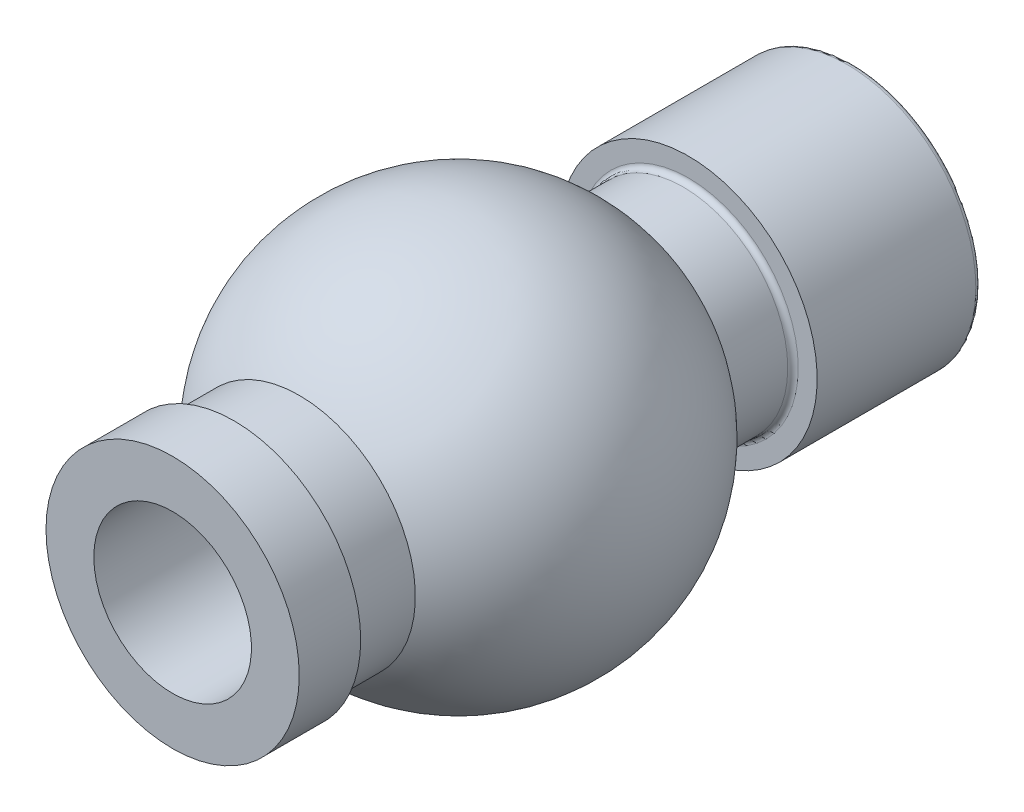
ISO-10303-21;
HEADER;
FILE_DESCRIPTION(('STEP AP214'),'2;1');
FILE_NAME('part.step','',(''),(''),'','','');
FILE_SCHEMA(('AUTOMOTIVE_DESIGN { 1 0 10303 214 1 1 1 1 }'));
ENDSEC;
DATA;
#1=APPLICATION_CONTEXT('core data for automotive mechanical design processes');
#2=APPLICATION_PROTOCOL_DEFINITION('international standard','automotive_design',2000,#1);
#3=PRODUCT_CONTEXT('',#1,'mechanical');
#4=PRODUCT('Part','Part','',(#3));
#5=PRODUCT_RELATED_PRODUCT_CATEGORY('part','',(#4));
#6=PRODUCT_DEFINITION_FORMATION('','',#4);
#7=PRODUCT_DEFINITION_CONTEXT('part definition',#1,'design');
#8=PRODUCT_DEFINITION('design','',#6,#7);
#9=PRODUCT_DEFINITION_SHAPE('','',#8);
#10=(LENGTH_UNIT() NAMED_UNIT(*) SI_UNIT(.MILLI.,.METRE.));
#11=(NAMED_UNIT(*) PLANE_ANGLE_UNIT() SI_UNIT($,.RADIAN.));
#12=(NAMED_UNIT(*) SI_UNIT($,.STERADIAN.) SOLID_ANGLE_UNIT());
#13=UNCERTAINTY_MEASURE_WITH_UNIT(LENGTH_MEASURE(1.E-05),#10,'distance_accuracy_value','');
#14=(GEOMETRIC_REPRESENTATION_CONTEXT(3) GLOBAL_UNCERTAINTY_ASSIGNED_CONTEXT((#13)) GLOBAL_UNIT_ASSIGNED_CONTEXT((#10,
#11,#12)) REPRESENTATION_CONTEXT('',''));
#15=CARTESIAN_POINT('',(0.,0.,0.));
#16=DIRECTION('',(0.,0.,1.));
#17=DIRECTION('',(1.,0.,0.));
#18=AXIS2_PLACEMENT_3D('',#15,#16,#17);
#19=CARTESIAN_POINT('',(0.,0.,3.12));
#20=DIRECTION('',(0.,0.,1.));
#21=DIRECTION('',(1.,0.,0.));
#22=AXIS2_PLACEMENT_3D('',#19,#20,#21);
#23=PLANE('',#22);
#24=CARTESIAN_POINT('',(0.,0.,3.12));
#25=DIRECTION('',(0.,0.,1.));
#26=DIRECTION('',(1.,0.,0.));
#27=AXIS2_PLACEMENT_3D('',#24,#25,#26);
#28=CIRCLE('',#27,2.09);
#29=CARTESIAN_POINT('',(2.09,0.,3.12));
#30=VERTEX_POINT('',#29);
#31=EDGE_CURVE('E10',#30,#30,#28,.F.);
#32=ORIENTED_EDGE('',*,*,#31,.T.);
#33=EDGE_LOOP('',(#32));
#34=FACE_BOUND('',#33,.T.);
#35=CARTESIAN_POINT('',(0.,0.,3.12));
#36=DIRECTION('',(0.,0.,1.));
#37=DIRECTION('',(1.,0.,0.));
#38=AXIS2_PLACEMENT_3D('',#35,#36,#37);
#39=CIRCLE('',#38,2.45);
#40=CARTESIAN_POINT('',(-2.45,0.,3.12));
#41=VERTEX_POINT('',#40);
#42=EDGE_CURVE('E54',#41,#41,#39,.T.);
#43=ORIENTED_EDGE('',*,*,#42,.T.);
#44=EDGE_LOOP('',(#43));
#45=FACE_BOUND('',#44,.T.);
#46=ADVANCED_FACE('F34',(#34,#45),#23,.T.);
#47=CARTESIAN_POINT('',(0.,0.,0.));
#48=DIRECTION('',(0.,0.,1.));
#49=DIRECTION('',(1.,0.,0.));
#50=AXIS2_PLACEMENT_3D('',#47,#48,#49);
#51=PLANE('',#50);
#52=CARTESIAN_POINT('',(0.,0.,0.));
#53=DIRECTION('',(0.,0.,1.));
#54=DIRECTION('',(1.,0.,0.));
#55=AXIS2_PLACEMENT_3D('',#52,#53,#54);
#56=CIRCLE('',#55,2.35);
#57=CARTESIAN_POINT('',(2.35,0.,0.));
#58=VERTEX_POINT('',#57);
#59=EDGE_CURVE('E45',#58,#58,#56,.F.);
#60=ORIENTED_EDGE('',*,*,#59,.T.);
#61=EDGE_LOOP('',(#60));
#62=FACE_BOUND('',#61,.T.);
#63=CARTESIAN_POINT('',(0.,0.,0.));
#64=DIRECTION('',(0.,0.,1.));
#65=DIRECTION('',(1.,0.,0.));
#66=AXIS2_PLACEMENT_3D('',#63,#64,#65);
#67=CIRCLE('',#66,1.5);
#68=CARTESIAN_POINT('',(-1.5,0.,0.));
#69=VERTEX_POINT('',#68);
#70=EDGE_CURVE('E57',#69,#69,#67,.T.);
#71=ORIENTED_EDGE('',*,*,#70,.T.);
#72=EDGE_LOOP('',(#71));
#73=FACE_BOUND('',#72,.T.);
#74=ADVANCED_FACE('F98',(#62,#73),#51,.F.);
#75=CARTESIAN_POINT('',(0.,0.,3.12));
#76=DIRECTION('',(0.,0.,-1.));
#77=DIRECTION('',(-1.,0.,0.));
#78=AXIS2_PLACEMENT_3D('',#75,#76,#77);
#79=CYLINDRICAL_SURFACE('',#78,2.45);
#80=CARTESIAN_POINT('',(0.,0.,0.0999999999999998));
#81=DIRECTION('',(0.,0.,1.));
#82=DIRECTION('',(1.,0.,0.));
#83=AXIS2_PLACEMENT_3D('',#80,#81,#82);
#84=CIRCLE('',#83,2.45);
#85=CARTESIAN_POINT('',(-2.45,0.,0.0999999999999994));
#86=VERTEX_POINT('',#85);
#87=EDGE_CURVE('E49',#86,#86,#84,.T.);
#88=CARTESIAN_POINT('',(-2.45,0.,0.0999999999999994));
#89=CARTESIAN_POINT('',(-2.45,0.,0.131458333333333));
#90=CARTESIAN_POINT('',(-2.45,0.,0.162916666666666));
#91=CARTESIAN_POINT('',(-2.45,0.,0.225833333333333));
#92=CARTESIAN_POINT('',(-2.45,0.,0.257291666666666));
#93=CARTESIAN_POINT('',(-2.45,0.,0.320208333333333));
#94=CARTESIAN_POINT('',(-2.45,0.,0.351666666666666));
#95=CARTESIAN_POINT('',(-2.45,0.,0.414583333333333));
#96=CARTESIAN_POINT('',(-2.45,0.,0.446041666666666));
#97=CARTESIAN_POINT('',(-2.45,0.,0.508958333333333));
#98=CARTESIAN_POINT('',(-2.45,0.,0.540416666666666));
#99=CARTESIAN_POINT('',(-2.45,0.,0.603333333333333));
#100=CARTESIAN_POINT('',(-2.45,0.,0.634791666666666));
#101=CARTESIAN_POINT('',(-2.45,0.,0.697708333333333));
#102=CARTESIAN_POINT('',(-2.45,0.,0.729166666666666));
#103=CARTESIAN_POINT('',(-2.45,0.,0.792083333333333));
#104=CARTESIAN_POINT('',(-2.45,0.,0.823541666666666));
#105=CARTESIAN_POINT('',(-2.45,0.,0.886458333333333));
#106=CARTESIAN_POINT('',(-2.45,0.,0.917916666666666));
#107=CARTESIAN_POINT('',(-2.45,0.,0.980833333333333));
#108=CARTESIAN_POINT('',(-2.45,0.,1.01229166666667));
#109=CARTESIAN_POINT('',(-2.45,0.,1.07520833333333));
#110=CARTESIAN_POINT('',(-2.45,0.,1.10666666666667));
#111=CARTESIAN_POINT('',(-2.45,0.,1.16958333333333));
#112=CARTESIAN_POINT('',(-2.45,0.,1.20104166666667));
#113=CARTESIAN_POINT('',(-2.45,0.,1.26395833333333));
#114=CARTESIAN_POINT('',(-2.45,0.,1.29541666666667));
#115=CARTESIAN_POINT('',(-2.45,0.,1.35833333333333));
#116=CARTESIAN_POINT('',(-2.45,0.,1.38979166666667));
#117=CARTESIAN_POINT('',(-2.45,0.,1.45270833333333));
#118=CARTESIAN_POINT('',(-2.45,0.,1.48416666666667));
#119=CARTESIAN_POINT('',(-2.45,0.,1.54708333333333));
#120=CARTESIAN_POINT('',(-2.45,0.,1.57854166666667));
#121=CARTESIAN_POINT('',(-2.45,0.,1.64145833333333));
#122=CARTESIAN_POINT('',(-2.45,0.,1.67291666666667));
#123=CARTESIAN_POINT('',(-2.45,0.,1.73583333333333));
#124=CARTESIAN_POINT('',(-2.45,0.,1.76729166666667));
#125=CARTESIAN_POINT('',(-2.45,0.,1.83020833333333));
#126=CARTESIAN_POINT('',(-2.45,0.,1.86166666666667));
#127=CARTESIAN_POINT('',(-2.45,0.,1.92458333333333));
#128=CARTESIAN_POINT('',(-2.45,0.,1.95604166666667));
#129=CARTESIAN_POINT('',(-2.45,0.,2.01895833333333));
#130=CARTESIAN_POINT('',(-2.45,0.,2.05041666666667));
#131=CARTESIAN_POINT('',(-2.45,0.,2.11333333333333));
#132=CARTESIAN_POINT('',(-2.45,0.,2.14479166666667));
#133=CARTESIAN_POINT('',(-2.45,0.,2.20770833333333));
#134=CARTESIAN_POINT('',(-2.45,0.,2.23916666666667));
#135=CARTESIAN_POINT('',(-2.45,0.,2.30208333333333));
#136=CARTESIAN_POINT('',(-2.45,0.,2.33354166666667));
#137=CARTESIAN_POINT('',(-2.45,0.,2.39645833333333));
#138=CARTESIAN_POINT('',(-2.45,0.,2.42791666666667));
#139=CARTESIAN_POINT('',(-2.45,0.,2.49083333333333));
#140=CARTESIAN_POINT('',(-2.45,0.,2.52229166666667));
#141=CARTESIAN_POINT('',(-2.45,0.,2.58520833333333));
#142=CARTESIAN_POINT('',(-2.45,0.,2.61666666666667));
#143=CARTESIAN_POINT('',(-2.45,0.,2.67958333333333));
#144=CARTESIAN_POINT('',(-2.45,0.,2.71104166666667));
#145=CARTESIAN_POINT('',(-2.45,0.,2.77395833333333));
#146=CARTESIAN_POINT('',(-2.45,0.,2.80541666666667));
#147=CARTESIAN_POINT('',(-2.45,0.,2.86833333333333));
#148=CARTESIAN_POINT('',(-2.45,0.,2.89979166666667));
#149=CARTESIAN_POINT('',(-2.45,0.,2.96270833333333));
#150=CARTESIAN_POINT('',(-2.45,0.,2.99416666666667));
#151=CARTESIAN_POINT('',(-2.45,0.,3.05708333333333));
#152=CARTESIAN_POINT('',(-2.45,0.,3.08854166666667));
#153=CARTESIAN_POINT('',(-2.45,0.,3.12));
#154=B_SPLINE_CURVE_WITH_KNOTS('',3,(#88,#89,#90,#91,#92,#93,#94,#95,#96,#97,#98,#99,#100,#101,
#102,#103,#104,#105,#106,#107,#108,#109,#110,#111,#112,#113,#114,#115,#116,#117,#118,#119,#120,
#121,#122,#123,#124,#125,#126,#127,#128,#129,#130,#131,#132,#133,#134,#135,#136,#137,#138,#139,
#140,#141,#142,#143,#144,#145,#146,#147,#148,#149,#150,#151,#152,#153),.UNSPECIFIED.,.F.,.F.,(4,
2,2,2,2,2,2,2,2,2,2,2,2,2,2,2,2,2,2,2,2,2,2,2,2,2,2,2,2,2,2,2,4),(0.,0.0943749999999998,0.18875,
0.283125,0.3775,0.471875,0.56625,0.660625,0.755,0.849375,0.94375,1.038125,1.1325,1.226875,
1.32125,1.415625,1.51,1.604375,1.69875,1.793125,1.8875,1.981875,2.07625,2.170625,2.265,2.359375,
2.45375,2.548125,2.6425,2.736875,2.83125,2.925625,3.02),.UNSPECIFIED.);
#155=EDGE_CURVE('BSEAM103',#86,#41,#154,.T.);
#156=ORIENTED_EDGE('',*,*,#87,.T.);
#157=ORIENTED_EDGE('',*,*,#42,.F.);
#158=ORIENTED_EDGE('',*,*,#155,.T.);
#159=ORIENTED_EDGE('',*,*,#155,.F.);
#160=EDGE_LOOP('',(#156,#158,#157,#159));
#161=FACE_BOUND('',#160,.T.);
#162=ADVANCED_FACE('F103',(#161),#79,.T.);
#163=CARTESIAN_POINT('',(0.,0.,3.12));
#164=DIRECTION('',(0.,0.,-1.));
#165=DIRECTION('',(-1.,0.,0.));
#166=AXIS2_PLACEMENT_3D('',#163,#164,#165);
#167=CYLINDRICAL_SURFACE('',#166,1.5);
#168=CARTESIAN_POINT('',(0.,0.,12.9380147147089));
#169=DIRECTION('',(0.,0.,1.));
#170=DIRECTION('',(1.,0.,0.));
#171=AXIS2_PLACEMENT_3D('',#168,#169,#170);
#172=CIRCLE('',#171,1.5);
#173=CARTESIAN_POINT('',(-1.5,0.,12.9380147147089));
#174=VERTEX_POINT('',#173);
#175=EDGE_CURVE('E73',#174,#174,#172,.T.);
#176=CARTESIAN_POINT('',(-1.5,0.,0.));
#177=CARTESIAN_POINT('',(-1.5,0.,0.134770986611551));
#178=CARTESIAN_POINT('',(-1.5,0.,0.269541973223101));
#179=CARTESIAN_POINT('',(-1.5,0.,0.539083946446203));
#180=CARTESIAN_POINT('',(-1.5,0.,0.673854933057754));
#181=CARTESIAN_POINT('',(-1.5,0.,0.943396906280855));
#182=CARTESIAN_POINT('',(-1.5,0.,1.07816789289241));
#183=CARTESIAN_POINT('',(-1.5,0.,1.34770986611551));
#184=CARTESIAN_POINT('',(-1.5,0.,1.48248085272706));
#185=CARTESIAN_POINT('',(-1.5,0.,1.75202282595016));
#186=CARTESIAN_POINT('',(-1.5,0.,1.88679381256171));
#187=CARTESIAN_POINT('',(-1.5,0.,2.15633578578481));
#188=CARTESIAN_POINT('',(-1.5,0.,2.29110677239636));
#189=CARTESIAN_POINT('',(-1.5,0.,2.56064874561946));
#190=CARTESIAN_POINT('',(-1.5,0.,2.69541973223102));
#191=CARTESIAN_POINT('',(-1.5,0.,2.96496170545412));
#192=CARTESIAN_POINT('',(-1.5,0.,3.09973269206567));
#193=CARTESIAN_POINT('',(-1.5,0.,3.36927466528877));
#194=CARTESIAN_POINT('',(-1.5,0.,3.50404565190032));
#195=CARTESIAN_POINT('',(-1.5,0.,3.77358762512342));
#196=CARTESIAN_POINT('',(-1.5,0.,3.90835861173497));
#197=CARTESIAN_POINT('',(-1.5,0.,4.17790058495807));
#198=CARTESIAN_POINT('',(-1.5,0.,4.31267157156962));
#199=CARTESIAN_POINT('',(-1.5,0.,4.58221354479273));
#200=CARTESIAN_POINT('',(-1.5,0.,4.71698453140428));
#201=CARTESIAN_POINT('',(-1.5,0.,4.98652650462738));
#202=CARTESIAN_POINT('',(-1.5,0.,5.12129749123893));
#203=CARTESIAN_POINT('',(-1.5,0.,5.39083946446203));
#204=CARTESIAN_POINT('',(-1.5,0.,5.52561045107358));
#205=CARTESIAN_POINT('',(-1.5,0.,5.79515242429668));
#206=CARTESIAN_POINT('',(-1.5,0.,5.92992341090824));
#207=CARTESIAN_POINT('',(-1.5,0.,6.19946538413134));
#208=CARTESIAN_POINT('',(-1.5,0.,6.33423637074289));
#209=CARTESIAN_POINT('',(-1.5,0.,6.60377834396599));
#210=CARTESIAN_POINT('',(-1.5,0.,6.73854933057754));
#211=CARTESIAN_POINT('',(-1.5,0.,7.00809130380064));
#212=CARTESIAN_POINT('',(-1.5,0.,7.14286229041219));
#213=CARTESIAN_POINT('',(-1.5,0.,7.41240426363529));
#214=CARTESIAN_POINT('',(-1.5,0.,7.54717525024684));
#215=CARTESIAN_POINT('',(-1.5,0.,7.81671722346994));
#216=CARTESIAN_POINT('',(-1.5,0.,7.9514882100815));
#217=CARTESIAN_POINT('',(-1.5,0.,8.2210301833046));
#218=CARTESIAN_POINT('',(-1.5,0.,8.35580116991615));
#219=CARTESIAN_POINT('',(-1.5,0.,8.62534314313925));
#220=CARTESIAN_POINT('',(-1.5,0.,8.7601141297508));
#221=CARTESIAN_POINT('',(-1.5,0.,9.0296561029739));
#222=CARTESIAN_POINT('',(-1.5,0.,9.16442708958545));
#223=CARTESIAN_POINT('',(-1.5,0.,9.43396906280855));
#224=CARTESIAN_POINT('',(-1.5,0.,9.56874004942011));
#225=CARTESIAN_POINT('',(-1.5,0.,9.83828202264321));
#226=CARTESIAN_POINT('',(-1.5,0.,9.97305300925476));
#227=CARTESIAN_POINT('',(-1.5,0.,10.2425949824779));
#228=CARTESIAN_POINT('',(-1.5,0.,10.3773659690894));
#229=CARTESIAN_POINT('',(-1.5,0.,10.6469079423125));
#230=CARTESIAN_POINT('',(-1.5,0.,10.7816789289241));
#231=CARTESIAN_POINT('',(-1.5,0.,11.0512209021472));
#232=CARTESIAN_POINT('',(-1.5,0.,11.1859918887587));
#233=CARTESIAN_POINT('',(-1.5,0.,11.4555338619818));
#234=CARTESIAN_POINT('',(-1.5,0.,11.5903048485934));
#235=CARTESIAN_POINT('',(-1.5,0.,11.8598468218165));
#236=CARTESIAN_POINT('',(-1.5,0.,11.994617808428));
#237=CARTESIAN_POINT('',(-1.5,0.,12.2641597816511));
#238=CARTESIAN_POINT('',(-1.5,0.,12.3989307682627));
#239=CARTESIAN_POINT('',(-1.5,0.,12.6684727414858));
#240=CARTESIAN_POINT('',(-1.5,0.,12.8032437280973));
#241=CARTESIAN_POINT('',(-1.5,0.,12.9380147147089));
#242=B_SPLINE_CURVE_WITH_KNOTS('',3,(#176,#177,#178,#179,#180,#181,#182,#183,#184,#185,#186,
#187,#188,#189,#190,#191,#192,#193,#194,#195,#196,#197,#198,#199,#200,#201,#202,#203,#204,#205,
#206,#207,#208,#209,#210,#211,#212,#213,#214,#215,#216,#217,#218,#219,#220,#221,#222,#223,#224,
#225,#226,#227,#228,#229,#230,#231,#232,#233,#234,#235,#236,#237,#238,#239,#240,#241),
.UNSPECIFIED.,.F.,.F.,(4,2,2,2,2,2,2,2,2,2,2,2,2,2,2,2,2,2,2,2,2,2,2,2,2,2,2,2,2,2,2,2,4),(0.,
0.404312959834652,0.808625919669305,1.21293887950396,1.61725183933861,2.02156479917326,
2.42587775900791,2.83019071884257,3.23450367867722,3.63881663851187,4.04312959834652,
4.44744255818117,4.85175551801583,5.25606847785048,5.66038143768513,6.06469439751979,
6.46900735735444,6.87332031718909,7.27763327702374,7.68194623685839,8.08625919669305,
8.4905721565277,8.89488511636235,9.299198076197,9.70351103603166,10.1078239958663,
10.512136955701,10.9164499155356,11.3207628753703,11.7250758352049,12.1293887950396,
12.5337017548742,12.9380147147089),.UNSPECIFIED.);
#243=EDGE_CURVE('BSEAM79',#69,#174,#242,.T.);
#244=ORIENTED_EDGE('',*,*,#70,.F.);
#245=ORIENTED_EDGE('',*,*,#175,.T.);
#246=ORIENTED_EDGE('',*,*,#243,.T.);
#247=ORIENTED_EDGE('',*,*,#243,.F.);
#248=EDGE_LOOP('',(#244,#246,#245,#247));
#249=FACE_BOUND('',#248,.T.);
#250=ADVANCED_FACE('F79',(#249),#167,.F.);
#251=CARTESIAN_POINT('',(0.,0.,4.32));
#252=DIRECTION('',(0.,0.,-1.));
#253=DIRECTION('',(-1.,0.,0.));
#254=AXIS2_PLACEMENT_3D('',#251,#252,#253);
#255=CYLINDRICAL_SURFACE('',#254,1.99);
#256=CARTESIAN_POINT('',(0.,0.,3.22));
#257=DIRECTION('',(0.,0.,1.));
#258=DIRECTION('',(1.,0.,0.));
#259=AXIS2_PLACEMENT_3D('',#256,#257,#258);
#260=CIRCLE('',#259,1.99);
#261=CARTESIAN_POINT('',(1.99,0.,3.22));
#262=VERTEX_POINT('',#261);
#263=EDGE_CURVE('E41',#262,#262,#260,.T.);
#264=ORIENTED_EDGE('',*,*,#263,.T.);
#265=EDGE_LOOP('',(#264));
#266=FACE_BOUND('',#265,.T.);
#267=CARTESIAN_POINT('',(0.,0.,4.32));
#268=DIRECTION('',(0.,0.,1.));
#269=DIRECTION('',(1.,0.,0.));
#270=AXIS2_PLACEMENT_3D('',#267,#268,#269);
#271=CIRCLE('',#270,1.99);
#272=CARTESIAN_POINT('',(0.,1.99,4.32));
#273=VERTEX_POINT('',#272);
#274=EDGE_CURVE('E60',#273,#273,#271,.T.);
#275=ORIENTED_EDGE('',*,*,#274,.F.);
#276=EDGE_LOOP('',(#275));
#277=FACE_BOUND('',#276,.T.);
#278=ADVANCED_FACE('F114',(#266,#277),#255,.T.);
#279=CARTESIAN_POINT('',(0.,0.,0.0999999999999998));
#280=DIRECTION('',(0.,0.,1.));
#281=DIRECTION('',(1.,0.,0.));
#282=AXIS2_PLACEMENT_3D('',#279,#280,#281);
#283=TOROIDAL_SURFACE('',#282,2.35,0.1);
#284=ORIENTED_EDGE('',*,*,#59,.F.);
#285=EDGE_LOOP('',(#284));
#286=FACE_BOUND('',#285,.T.);
#287=ORIENTED_EDGE('',*,*,#87,.F.);
#288=EDGE_LOOP('',(#287));
#289=FACE_BOUND('',#288,.T.);
#290=ADVANCED_FACE('F112',(#286,#289),#283,.T.);
#291=CARTESIAN_POINT('',(0.,0.,3.22));
#292=DIRECTION('',(0.,0.,1.));
#293=DIRECTION('',(1.,0.,0.));
#294=AXIS2_PLACEMENT_3D('',#291,#292,#293);
#295=TOROIDAL_SURFACE('',#294,2.09,0.1);
#296=ORIENTED_EDGE('',*,*,#31,.F.);
#297=EDGE_LOOP('',(#296));
#298=FACE_BOUND('',#297,.T.);
#299=ORIENTED_EDGE('',*,*,#263,.F.);
#300=EDGE_LOOP('',(#299));
#301=FACE_BOUND('',#300,.T.);
#302=ADVANCED_FACE('F36',(#298,#301),#295,.F.);
#303=CARTESIAN_POINT('',(0.,0.,7.49842728405103));
#304=DIRECTION('',(0.,0.,-1.));
#305=DIRECTION('',(0.,1.,0.));
#306=AXIS2_PLACEMENT_3D('',#303,#304,#305);
#307=SPHERICAL_SURFACE('',#306,3.75);
#308=CARTESIAN_POINT('',(0.,0.,10.5280147147089));
#309=DIRECTION('',(0.,0.,1.));
#310=DIRECTION('',(1.,0.,0.));
#311=AXIS2_PLACEMENT_3D('',#308,#309,#310);
#312=CIRCLE('',#311,2.21);
#313=CARTESIAN_POINT('',(0.,2.21,10.5280147147089));
#314=VERTEX_POINT('',#313);
#315=EDGE_CURVE('E64',#314,#314,#312,.T.);
#316=CARTESIAN_POINT('',(0.,2.21,10.5280147147089));
#317=CARTESIAN_POINT('',(0.,2.27160271418324,10.4830810826455));
#318=CARTESIAN_POINT('',(0.,2.33183104269488,10.4362639251855));
#319=CARTESIAN_POINT('',(0.,2.44932359030822,10.3390472167184));
#320=CARTESIAN_POINT('',(0.,2.50658780940992,10.2886476657112));
#321=CARTESIAN_POINT('',(0.,2.61793680013662,10.1844508273957));
#322=CARTESIAN_POINT('',(0.,2.67202157176163,10.1306535400873));
#323=CARTESIAN_POINT('',(0.,2.77681111052154,10.0198620956911));
#324=CARTESIAN_POINT('',(0.,2.82751587765644,9.96286793860343));
#325=CARTESIAN_POINT('',(0.,2.92535663155269,9.84589455596459));
#326=CARTESIAN_POINT('',(0.,2.97249261831403,9.78591533041346));
#327=CARTESIAN_POINT('',(0.,3.06302052262955,9.66319497220088));
#328=CARTESIAN_POINT('',(0.,3.10641244018373,9.60045383953942));
#329=CARTESIAN_POINT('',(0.,3.18929078738361,9.47244303334777));
#330=CARTESIAN_POINT('',(0.,3.22877721702931,9.40717335981758));
#331=CARTESIAN_POINT('',(0.,3.30369771234293,9.27434826205245));
#332=CARTESIAN_POINT('',(0.,3.33913177801086,9.20679283781752));
#333=CARTESIAN_POINT('',(0.,3.40581573896314,9.06964752627558));
#334=CARTESIAN_POINT('',(0.,3.4370656342475,9.00005763896857));
#335=CARTESIAN_POINT('',(0.,3.49526501314994,8.85910225791207));
#336=CARTESIAN_POINT('',(0.,3.52221449676802,8.7877367641626));
#337=CARTESIAN_POINT('',(0.,3.57171280717944,8.64349563129264));
#338=CARTESIAN_POINT('',(0.,3.59426163397277,8.57061999217215));
#339=CARTESIAN_POINT('',(0.,3.63487475495789,8.423629647076));
#340=CARTESIAN_POINT('',(0.,3.65293904914968,8.34951494110033));
#341=CARTESIAN_POINT('',(0.,3.68451591043326,8.20032214979191));
#342=CARTESIAN_POINT('',(0.,3.69802847752505,8.12524406445915));
#343=CARTESIAN_POINT('',(0.,3.72045162136127,7.97440378546303));
#344=CARTESIAN_POINT('',(0.,3.72936219810571,7.89864159179967));
#345=CARTESIAN_POINT('',(0.,3.74254821621013,7.74671491187274));
#346=CARTESIAN_POINT('',(0.,3.7468236575701,7.67055042560918));
#347=CARTESIAN_POINT('',(0.,3.75072350137155,7.51810247263699));
#348=CARTESIAN_POINT('',(0.,3.75034790381303,7.44181900592836));
#349=CARTESIAN_POINT('',(0.,3.74494706690306,7.28941684679749));
#350=CARTESIAN_POINT('',(0.,3.73992182755162,7.21329815437524));
#351=CARTESIAN_POINT('',(0.,3.72524039964422,7.06150868563091));
#352=CARTESIAN_POINT('',(0.,3.71558421108825,6.98583790930883));
#353=CARTESIAN_POINT('',(0.,3.69167680329128,6.83522574844691));
#354=CARTESIAN_POINT('',(0.,3.67742558405027,6.76028436390706));
#355=CARTESIAN_POINT('',(0.,3.64438112572665,6.61140974914274));
#356=CARTESIAN_POINT('',(0.,3.62558788664403,6.53747651891825));
#357=CARTESIAN_POINT('',(0.,3.58352929461626,6.39089322524683));
#358=CARTESIAN_POINT('',(0.,3.5602639416711,6.3182431617999));
#359=CARTESIAN_POINT('',(0.,3.50934766300731,6.17449644109063));
#360=CARTESIAN_POINT('',(0.,3.48169673728867,6.1033997838283));
#361=CARTESIAN_POINT('',(0.,3.42211216734222,5.96302433665361));
#362=CARTESIAN_POINT('',(0.,3.39017852311442,5.89374554674126));
#363=CARTESIAN_POINT('',(0.,3.32214730108878,5.75726353333617));
#364=CARTESIAN_POINT('',(0.,3.28604972329094,5.69006030984343));
#365=CARTESIAN_POINT('',(0.,3.20982490755121,5.55797940815182));
#366=CARTESIAN_POINT('',(0.,3.16969766960932,5.49310172995296));
#367=CARTESIAN_POINT('',(0.,3.08556279729622,5.36591324590187));
#368=CARTESIAN_POINT('',(0.,3.04155516292502,5.30360244004965));
#369=CARTESIAN_POINT('',(0.,2.94982319181616,5.18177948485276));
#370=CARTESIAN_POINT('',(0.,2.9020988550785,5.12226733550811));
#371=CARTESIAN_POINT('',(0.,2.80311101235721,5.00626304777283));
#372=CARTESIAN_POINT('',(0.,2.75184750637358,4.9497709093822));
#373=CARTESIAN_POINT('',(0.,2.64597197124335,4.84001683688443));
#374=CARTESIAN_POINT('',(0.,2.59135994209675,4.78675490277728));
#375=CARTESIAN_POINT('',(0.,2.47899065579482,4.68365914592528));
#376=CARTESIAN_POINT('',(0.,2.42123339863951,4.63382532318042));
#377=CARTESIAN_POINT('',(0.,2.302787929007,4.53777195481497));
#378=CARTESIAN_POINT('',(0.,2.24209971652982,4.49155240919438));
#379=CARTESIAN_POINT('',(0.,2.11802020550494,4.40289654591573));
#380=CARTESIAN_POINT('',(0.,2.05462890695725,4.36046022825767));
#381=CARTESIAN_POINT('',(0.,1.99,4.32));
#382=B_SPLINE_CURVE_WITH_KNOTS('',3,(#316,#317,#318,#319,#320,#321,#322,#323,#324,#325,#326,
#327,#328,#329,#330,#331,#332,#333,#334,#335,#336,#337,#338,#339,#340,#341,#342,#343,#344,#345,
#346,#347,#348,#349,#350,#351,#352,#353,#354,#355,#356,#357,#358,#359,#360,#361,#362,#363,#364,
#365,#366,#367,#368,#369,#370,#371,#372,#373,#374,#375,#376,#377,#378,#379,#380,#381),
.UNSPECIFIED.,.F.,.F.,(4,2,2,2,2,2,2,2,2,2,2,2,2,2,2,2,2,2,2,2,2,2,2,2,2,2,2,2,2,2,2,2,4),(0.,
0.22871129502297,0.45742259004594,0.686133885068908,0.914845180091878,1.14355647511485,
1.37226777013782,1.60097906516079,1.82969036018376,2.05840165520673,2.2871129502297,
2.51582424525267,2.74453554027564,2.97324683529861,3.20195813032158,3.43066942534454,
3.65938072036751,3.88809201539048,4.11680331041345,4.34551460543642,4.57422590045939,
4.80293719548236,5.03164849050533,5.2603597855283,5.48907108055127,5.71778237557424,
5.94649367059721,6.17520496562018,6.40391626064315,6.63262755566612,6.86133885068909,
7.09005014571206,7.31876144073503),.UNSPECIFIED.);
#383=EDGE_CURVE('BSEAM94',#314,#273,#382,.T.);
#384=ORIENTED_EDGE('',*,*,#315,.F.);
#385=ORIENTED_EDGE('',*,*,#274,.T.);
#386=ORIENTED_EDGE('',*,*,#383,.T.);
#387=ORIENTED_EDGE('',*,*,#383,.F.);
#388=EDGE_LOOP('',(#384,#386,#385,#387));
#389=FACE_BOUND('',#388,.T.);
#390=ADVANCED_FACE('F94',(#389),#307,.T.);
#391=CARTESIAN_POINT('',(0.,0.,11.7680147147089));
#392=DIRECTION('',(0.,0.,-1.));
#393=DIRECTION('',(-1.,0.,0.));
#394=AXIS2_PLACEMENT_3D('',#391,#392,#393);
#395=CYLINDRICAL_SURFACE('',#394,2.21);
#396=CARTESIAN_POINT('',(0.,0.,11.7680147147089));
#397=DIRECTION('',(0.,0.,1.));
#398=DIRECTION('',(1.,0.,0.));
#399=AXIS2_PLACEMENT_3D('',#396,#397,#398);
#400=CIRCLE('',#399,2.21);
#401=CARTESIAN_POINT('',(2.21,0.,11.7680147147089));
#402=VERTEX_POINT('',#401);
#403=EDGE_CURVE('E63',#402,#402,#400,.T.);
#404=ORIENTED_EDGE('',*,*,#403,.F.);
#405=EDGE_LOOP('',(#404));
#406=FACE_BOUND('',#405,.T.);
#407=ORIENTED_EDGE('',*,*,#315,.T.);
#408=EDGE_LOOP('',(#407));
#409=FACE_BOUND('',#408,.T.);
#410=ADVANCED_FACE('F84',(#406,#409),#395,.T.);
#411=CARTESIAN_POINT('',(0.,0.,12.9380147147089));
#412=DIRECTION('',(0.,0.,1.));
#413=DIRECTION('',(1.,0.,0.));
#414=AXIS2_PLACEMENT_3D('',#411,#412,#413);
#415=PLANE('',#414);
#416=CARTESIAN_POINT('',(0.,0.,12.9380147147089));
#417=DIRECTION('',(0.,0.,1.));
#418=DIRECTION('',(1.,0.,0.));
#419=AXIS2_PLACEMENT_3D('',#416,#417,#418);
#420=CIRCLE('',#419,2.41);
#421=CARTESIAN_POINT('',(-2.41,0.,12.9380147147089));
#422=VERTEX_POINT('',#421);
#423=EDGE_CURVE('E67',#422,#422,#420,.T.);
#424=ORIENTED_EDGE('',*,*,#423,.T.);
#425=EDGE_LOOP('',(#424));
#426=FACE_BOUND('',#425,.T.);
#427=ORIENTED_EDGE('',*,*,#175,.F.);
#428=EDGE_LOOP('',(#427));
#429=FACE_BOUND('',#428,.T.);
#430=ADVANCED_FACE('F81',(#426,#429),#415,.T.);
#431=CARTESIAN_POINT('',(0.,0.,11.7680147147089));
#432=DIRECTION('',(0.,0.,1.));
#433=DIRECTION('',(1.,0.,0.));
#434=AXIS2_PLACEMENT_3D('',#431,#432,#433);
#435=PLANE('',#434);
#436=ORIENTED_EDGE('',*,*,#403,.T.);
#437=EDGE_LOOP('',(#436));
#438=FACE_BOUND('',#437,.T.);
#439=CARTESIAN_POINT('',(0.,0.,11.7680147147089));
#440=DIRECTION('',(0.,0.,1.));
#441=DIRECTION('',(1.,0.,0.));
#442=AXIS2_PLACEMENT_3D('',#439,#440,#441);
#443=CIRCLE('',#442,2.41);
#444=CARTESIAN_POINT('',(-2.41,0.,11.7680147147089));
#445=VERTEX_POINT('',#444);
#446=EDGE_CURVE('E70',#445,#445,#443,.T.);
#447=ORIENTED_EDGE('',*,*,#446,.F.);
#448=EDGE_LOOP('',(#447));
#449=FACE_BOUND('',#448,.T.);
#450=ADVANCED_FACE('F83',(#438,#449),#435,.F.);
#451=CARTESIAN_POINT('',(0.,0.,12.9380147147089));
#452=DIRECTION('',(0.,0.,-1.));
#453=DIRECTION('',(-1.,0.,0.));
#454=AXIS2_PLACEMENT_3D('',#451,#452,#453);
#455=CYLINDRICAL_SURFACE('',#454,2.41);
#456=CARTESIAN_POINT('',(-2.41,0.,12.9380147147089));
#457=CARTESIAN_POINT('',(-2.41,0.,12.9258272147089));
#458=CARTESIAN_POINT('',(-2.41,0.,12.9136397147089));
#459=CARTESIAN_POINT('',(-2.41,0.,12.8892647147089));
#460=CARTESIAN_POINT('',(-2.41,0.,12.8770772147089));
#461=CARTESIAN_POINT('',(-2.41,0.,12.8527022147089));
#462=CARTESIAN_POINT('',(-2.41,0.,12.8405147147089));
#463=CARTESIAN_POINT('',(-2.41,0.,12.8161397147089));
#464=CARTESIAN_POINT('',(-2.41,0.,12.8039522147089));
#465=CARTESIAN_POINT('',(-2.41,0.,12.7795772147089));
#466=CARTESIAN_POINT('',(-2.41,0.,12.7673897147089));
#467=CARTESIAN_POINT('',(-2.41,0.,12.7430147147089));
#468=CARTESIAN_POINT('',(-2.41,0.,12.7308272147089));
#469=CARTESIAN_POINT('',(-2.41,0.,12.7064522147089));
#470=CARTESIAN_POINT('',(-2.41,0.,12.6942647147089));
#471=CARTESIAN_POINT('',(-2.41,0.,12.6698897147089));
#472=CARTESIAN_POINT('',(-2.41,0.,12.6577022147089));
#473=CARTESIAN_POINT('',(-2.41,0.,12.6333272147089));
#474=CARTESIAN_POINT('',(-2.41,0.,12.6211397147089));
#475=CARTESIAN_POINT('',(-2.41,0.,12.5967647147089));
#476=CARTESIAN_POINT('',(-2.41,0.,12.5845772147089));
#477=CARTESIAN_POINT('',(-2.41,0.,12.5602022147089));
#478=CARTESIAN_POINT('',(-2.41,0.,12.5480147147089));
#479=CARTESIAN_POINT('',(-2.41,0.,12.5236397147089));
#480=CARTESIAN_POINT('',(-2.41,0.,12.5114522147089));
#481=CARTESIAN_POINT('',(-2.41,0.,12.4870772147089));
#482=CARTESIAN_POINT('',(-2.41,0.,12.4748897147089));
#483=CARTESIAN_POINT('',(-2.41,0.,12.4505147147089));
#484=CARTESIAN_POINT('',(-2.41,0.,12.4383272147089));
#485=CARTESIAN_POINT('',(-2.41,0.,12.4139522147089));
#486=CARTESIAN_POINT('',(-2.41,0.,12.4017647147089));
#487=CARTESIAN_POINT('',(-2.41,0.,12.3773897147089));
#488=CARTESIAN_POINT('',(-2.41,0.,12.3652022147089));
#489=CARTESIAN_POINT('',(-2.41,0.,12.3408272147089));
#490=CARTESIAN_POINT('',(-2.41,0.,12.3286397147089));
#491=CARTESIAN_POINT('',(-2.41,0.,12.3042647147089));
#492=CARTESIAN_POINT('',(-2.41,0.,12.2920772147089));
#493=CARTESIAN_POINT('',(-2.41,0.,12.2677022147089));
#494=CARTESIAN_POINT('',(-2.41,0.,12.2555147147089));
#495=CARTESIAN_POINT('',(-2.41,0.,12.2311397147089));
#496=CARTESIAN_POINT('',(-2.41,0.,12.2189522147089));
#497=CARTESIAN_POINT('',(-2.41,0.,12.1945772147089));
#498=CARTESIAN_POINT('',(-2.41,0.,12.1823897147089));
#499=CARTESIAN_POINT('',(-2.41,0.,12.1580147147089));
#500=CARTESIAN_POINT('',(-2.41,0.,12.1458272147089));
#501=CARTESIAN_POINT('',(-2.41,0.,12.1214522147089));
#502=CARTESIAN_POINT('',(-2.41,0.,12.1092647147089));
#503=CARTESIAN_POINT('',(-2.41,0.,12.0848897147089));
#504=CARTESIAN_POINT('',(-2.41,0.,12.0727022147089));
#505=CARTESIAN_POINT('',(-2.41,0.,12.0483272147089));
#506=CARTESIAN_POINT('',(-2.41,0.,12.0361397147089));
#507=CARTESIAN_POINT('',(-2.41,0.,12.0117647147089));
#508=CARTESIAN_POINT('',(-2.41,0.,11.9995772147089));
#509=CARTESIAN_POINT('',(-2.41,0.,11.9752022147089));
#510=CARTESIAN_POINT('',(-2.41,0.,11.9630147147089));
#511=CARTESIAN_POINT('',(-2.41,0.,11.9386397147089));
#512=CARTESIAN_POINT('',(-2.41,0.,11.9264522147089));
#513=CARTESIAN_POINT('',(-2.41,0.,11.9020772147089));
#514=CARTESIAN_POINT('',(-2.41,0.,11.8898897147089));
#515=CARTESIAN_POINT('',(-2.41,0.,11.8655147147089));
#516=CARTESIAN_POINT('',(-2.41,0.,11.8533272147089));
#517=CARTESIAN_POINT('',(-2.41,0.,11.8289522147089));
#518=CARTESIAN_POINT('',(-2.41,0.,11.8167647147089));
#519=CARTESIAN_POINT('',(-2.41,0.,11.7923897147089));
#520=CARTESIAN_POINT('',(-2.41,0.,11.7802022147089));
#521=CARTESIAN_POINT('',(-2.41,0.,11.7680147147089));
#522=B_SPLINE_CURVE_WITH_KNOTS('',3,(#456,#457,#458,#459,#460,#461,#462,#463,#464,#465,#466,
#467,#468,#469,#470,#471,#472,#473,#474,#475,#476,#477,#478,#479,#480,#481,#482,#483,#484,#485,
#486,#487,#488,#489,#490,#491,#492,#493,#494,#495,#496,#497,#498,#499,#500,#501,#502,#503,#504,
#505,#506,#507,#508,#509,#510,#511,#512,#513,#514,#515,#516,#517,#518,#519,#520,#521),
.UNSPECIFIED.,.F.,.F.,(4,2,2,2,2,2,2,2,2,2,2,2,2,2,2,2,2,2,2,2,2,2,2,2,2,2,2,2,2,2,2,2,4),(0.,
0.0365624999999984,0.0731249999999985,0.109687499999999,0.146249999999999,0.182812499999999,
0.219374999999999,0.255937499999999,0.292499999999999,0.329062499999999,0.365625,
0.402187499999998,0.438749999999998,0.475312499999998,0.511874999999998,0.548437499999999,
0.584999999999999,0.621562499999999,0.658124999999999,0.694687499999999,0.731249999999999,
0.767812499999998,0.804374999999998,0.840937499999998,0.877499999999998,0.914062499999998,
0.950624999999998,0.987187499999998,1.02375,1.0603125,1.096875,1.1334375,1.17),.UNSPECIFIED.);
#523=EDGE_CURVE('BSEAM91',#422,#445,#522,.T.);
#524=ORIENTED_EDGE('',*,*,#423,.F.);
#525=ORIENTED_EDGE('',*,*,#446,.T.);
#526=ORIENTED_EDGE('',*,*,#523,.T.);
#527=ORIENTED_EDGE('',*,*,#523,.F.);
#528=EDGE_LOOP('',(#524,#526,#525,#527));
#529=FACE_BOUND('',#528,.T.);
#530=ADVANCED_FACE('F91',(#529),#455,.T.);
#531=CLOSED_SHELL('',(#46,#74,#162,#250,#278,#290,#302,#390,#410,#430,#450,#530));
#532=MANIFOLD_SOLID_BREP('B2',#531);
#533=ADVANCED_BREP_SHAPE_REPRESENTATION('',(#18,#532),#14);
#534=SHAPE_DEFINITION_REPRESENTATION(#9,#533);
ENDSEC;
END-ISO-10303-21;
